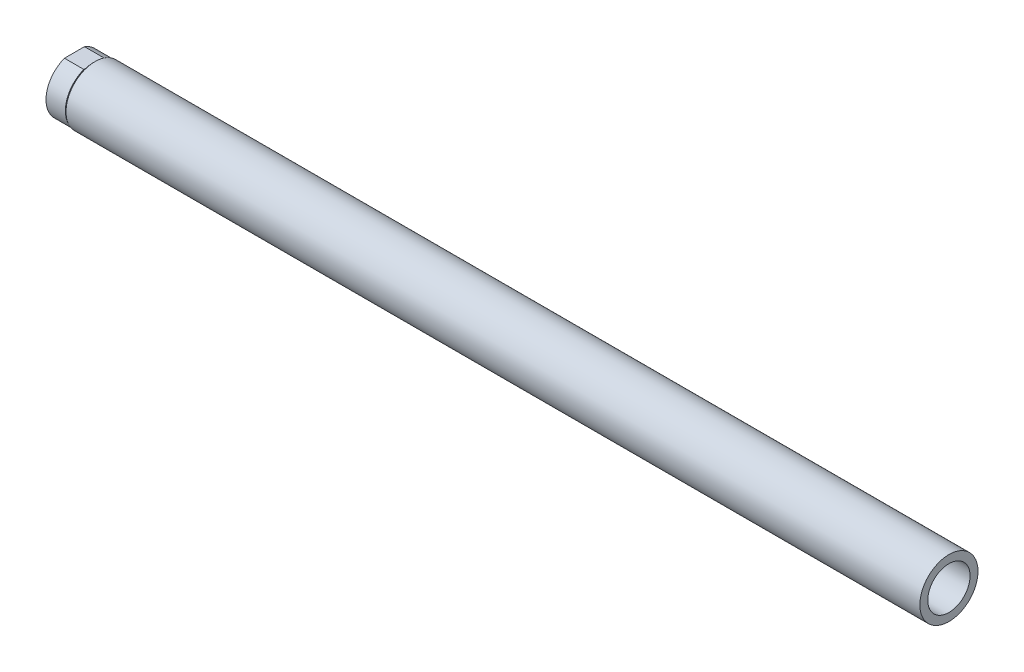
ISO-10303-21;
HEADER;
FILE_DESCRIPTION(('STEP AP214'),'2;1');
FILE_NAME('part.step','',(''),(''),'','','');
FILE_SCHEMA(('AUTOMOTIVE_DESIGN { 1 0 10303 214 1 1 1 1 }'));
ENDSEC;
DATA;
#1=APPLICATION_CONTEXT('core data for automotive mechanical design processes');
#2=APPLICATION_PROTOCOL_DEFINITION('international standard','automotive_design',2000,#1);
#3=PRODUCT_CONTEXT('',#1,'mechanical');
#4=PRODUCT('Part','Part','',(#3));
#5=PRODUCT_RELATED_PRODUCT_CATEGORY('part','',(#4));
#6=PRODUCT_DEFINITION_FORMATION('','',#4);
#7=PRODUCT_DEFINITION_CONTEXT('part definition',#1,'design');
#8=PRODUCT_DEFINITION('design','',#6,#7);
#9=PRODUCT_DEFINITION_SHAPE('','',#8);
#10=(LENGTH_UNIT() NAMED_UNIT(*) SI_UNIT(.MILLI.,.METRE.));
#11=(NAMED_UNIT(*) PLANE_ANGLE_UNIT() SI_UNIT($,.RADIAN.));
#12=(NAMED_UNIT(*) SI_UNIT($,.STERADIAN.) SOLID_ANGLE_UNIT());
#13=UNCERTAINTY_MEASURE_WITH_UNIT(LENGTH_MEASURE(1.E-05),#10,'distance_accuracy_value','');
#14=(GEOMETRIC_REPRESENTATION_CONTEXT(3) GLOBAL_UNCERTAINTY_ASSIGNED_CONTEXT((#13)) GLOBAL_UNIT_ASSIGNED_CONTEXT((#10,
#11,#12)) REPRESENTATION_CONTEXT('',''));
#15=CARTESIAN_POINT('',(0.,0.,0.));
#16=DIRECTION('',(0.,0.,1.));
#17=DIRECTION('',(1.,0.,0.));
#18=AXIS2_PLACEMENT_3D('',#15,#16,#17);
#19=CARTESIAN_POINT('',(-23.6261718694748,0.,0.));
#20=DIRECTION('',(1.,0.,0.));
#21=DIRECTION('',(0.,0.,-1.));
#22=AXIS2_PLACEMENT_3D('',#19,#20,#21);
#23=CYLINDRICAL_SURFACE('',#22,5.87499999999999);
#24=DIRECTION('',(1.,0.,0.));
#25=VECTOR('',#24,1.);
#26=CARTESIAN_POINT('',(-23.6261718694748,-5.49999999999998,2.0653389552323));
#27=LINE('',#26,#25);
#28=CARTESIAN_POINT('',(-88.25,-5.50000000000001,2.06533895523223));
#29=VERTEX_POINT('',#28);
#30=CARTESIAN_POINT('',(-92.25,-5.50000000000001,2.0653389552323));
#31=VERTEX_POINT('',#30);
#32=EDGE_CURVE('E97',#29,#31,#27,.F.);
#33=ORIENTED_EDGE('',*,*,#32,.F.);
#34=CARTESIAN_POINT('',(-88.25,0.,0.));
#35=DIRECTION('',(1.,0.,0.));
#36=DIRECTION('',(0.,0.,-1.));
#37=AXIS2_PLACEMENT_3D('',#34,#35,#36);
#38=CIRCLE('',#37,5.87499999999999);
#39=CARTESIAN_POINT('',(-88.25,5.5,2.06533895523227));
#40=VERTEX_POINT('',#39);
#41=EDGE_CURVE('E112',#40,#29,#38,.T.);
#42=ORIENTED_EDGE('',*,*,#41,.F.);
#43=DIRECTION('',(1.,0.,0.));
#44=VECTOR('',#43,1.);
#45=CARTESIAN_POINT('',(-23.6261718694748,5.5,2.06533895523227));
#46=LINE('',#45,#44);
#47=CARTESIAN_POINT('',(-92.25,5.5,2.06533895523227));
#48=VERTEX_POINT('',#47);
#49=EDGE_CURVE('E101',#48,#40,#46,.T.);
#50=ORIENTED_EDGE('',*,*,#49,.F.);
#51=CARTESIAN_POINT('',(-92.25,0.,0.));
#52=DIRECTION('',(1.,0.,0.));
#53=DIRECTION('',(0.,0.,-1.));
#54=AXIS2_PLACEMENT_3D('',#51,#52,#53);
#55=CIRCLE('',#54,5.87499999999999);
#56=EDGE_CURVE('E108',#48,#31,#55,.T.);
#57=ORIENTED_EDGE('',*,*,#56,.T.);
#58=EDGE_LOOP('',(#33,#42,#50,#57));
#59=FACE_BOUND('',#58,.T.);
#60=ADVANCED_FACE('F16',(#59),#23,.T.);
#61=CARTESIAN_POINT('',(-88.25,5.87499999999999,0.));
#62=DIRECTION('',(1.,0.,0.));
#63=DIRECTION('',(0.,0.,-1.));
#64=AXIS2_PLACEMENT_3D('',#61,#62,#63);
#65=PLANE('',#64);
#66=DIRECTION('',(0.,0.,1.));
#67=VECTOR('',#66,1.);
#68=CARTESIAN_POINT('',(-88.25,-5.50000000000001,0.));
#69=LINE('',#68,#67);
#70=CARTESIAN_POINT('',(-88.25,-5.50000000000001,-2.06533895523223));
#71=VERTEX_POINT('',#70);
#72=CARTESIAN_POINT('',(-88.25,-5.50000000000001,-1.66587381349842));
#73=VERTEX_POINT('',#72);
#74=EDGE_CURVE('E11',#71,#73,#69,.T.);
#75=ORIENTED_EDGE('',*,*,#74,.F.);
#76=CARTESIAN_POINT('',(-88.25,5.5,-2.06533895523227));
#77=VERTEX_POINT('',#76);
#78=EDGE_CURVE('E111',#71,#77,#38,.T.);
#79=ORIENTED_EDGE('',*,*,#78,.T.);
#80=DIRECTION('',(0.,0.,-1.));
#81=VECTOR('',#80,1.);
#82=CARTESIAN_POINT('',(-88.25,5.5,0.));
#83=LINE('',#82,#81);
#84=CARTESIAN_POINT('',(-88.25,5.5,-1.66587381349848));
#85=VERTEX_POINT('',#84);
#86=EDGE_CURVE('E130',#85,#77,#83,.T.);
#87=ORIENTED_EDGE('',*,*,#86,.F.);
#88=CARTESIAN_POINT('',(-88.25,0.,0.));
#89=DIRECTION('',(1.,0.,0.));
#90=DIRECTION('',(0.,0.,-1.));
#91=AXIS2_PLACEMENT_3D('',#88,#89,#90);
#92=CIRCLE('',#91,5.74674999999999);
#93=EDGE_CURVE('E128',#85,#73,#92,.F.);
#94=ORIENTED_EDGE('',*,*,#93,.T.);
#95=EDGE_LOOP('',(#75,#79,#87,#94));
#96=FACE_BOUND('',#95,.T.);
#97=ADVANCED_FACE('F154',(#96),#65,.T.);
#98=CARTESIAN_POINT('',(88.25,0.,0.));
#99=DIRECTION('',(1.,0.,0.));
#100=DIRECTION('',(0.,0.,-1.));
#101=AXIS2_PLACEMENT_3D('',#98,#99,#100);
#102=PLANE('',#101);
#103=CARTESIAN_POINT('',(88.25,0.,0.));
#104=DIRECTION('',(1.,0.,0.));
#105=DIRECTION('',(0.,0.,-1.));
#106=AXIS2_PLACEMENT_3D('',#103,#104,#105);
#107=CIRCLE('',#106,6.00075);
#108=CARTESIAN_POINT('',(88.25,0.,-6.00075));
#109=VERTEX_POINT('',#108);
#110=EDGE_CURVE('E118',#109,#109,#107,.T.);
#111=ORIENTED_EDGE('',*,*,#110,.T.);
#112=EDGE_LOOP('',(#111));
#113=FACE_BOUND('',#112,.T.);
#114=CARTESIAN_POINT('',(88.25,0.,0.));
#115=DIRECTION('',(1.,0.,0.));
#116=DIRECTION('',(0.,0.,-1.));
#117=AXIS2_PLACEMENT_3D('',#114,#115,#116);
#118=CIRCLE('',#117,4.365);
#119=CARTESIAN_POINT('',(88.25,0.,-4.365));
#120=VERTEX_POINT('',#119);
#121=EDGE_CURVE('E115',#120,#120,#118,.T.);
#122=ORIENTED_EDGE('',*,*,#121,.F.);
#123=EDGE_LOOP('',(#122));
#124=FACE_BOUND('',#123,.T.);
#125=ADVANCED_FACE('F178',(#113,#124),#102,.T.);
#126=CARTESIAN_POINT('',(88.25,0.,0.));
#127=DIRECTION('',(-1.,0.,0.));
#128=DIRECTION('',(0.,0.,1.));
#129=AXIS2_PLACEMENT_3D('',#126,#127,#128);
#130=CYLINDRICAL_SURFACE('',#129,6.00075);
#131=CARTESIAN_POINT('',(-87.996,0.,0.));
#132=DIRECTION('',(1.,0.,0.));
#133=DIRECTION('',(0.,0.,-1.));
#134=AXIS2_PLACEMENT_3D('',#131,#132,#133);
#135=CIRCLE('',#134,6.00075);
#136=CARTESIAN_POINT('',(-87.996,0.,-6.00075));
#137=VERTEX_POINT('',#136);
#138=EDGE_CURVE('E121',#137,#137,#135,.T.);
#139=ORIENTED_EDGE('',*,*,#138,.T.);
#140=EDGE_LOOP('',(#139));
#141=FACE_BOUND('',#140,.T.);
#142=ORIENTED_EDGE('',*,*,#110,.F.);
#143=EDGE_LOOP('',(#142));
#144=FACE_BOUND('',#143,.T.);
#145=ADVANCED_FACE('F252',(#141,#144),#130,.T.);
#146=CARTESIAN_POINT('',(88.25,0.,0.));
#147=DIRECTION('',(-1.,0.,0.));
#148=DIRECTION('',(0.,0.,1.));
#149=AXIS2_PLACEMENT_3D('',#146,#147,#148);
#150=CYLINDRICAL_SURFACE('',#149,4.365);
#151=CARTESIAN_POINT('',(-81.455,0.,0.));
#152=DIRECTION('',(1.,0.,0.));
#153=DIRECTION('',(0.,0.,-1.));
#154=AXIS2_PLACEMENT_3D('',#151,#152,#153);
#155=CIRCLE('',#154,4.365);
#156=CARTESIAN_POINT('',(-81.455,0.,-4.365));
#157=VERTEX_POINT('',#156);
#158=EDGE_CURVE('E127',#157,#157,#155,.T.);
#159=ORIENTED_EDGE('',*,*,#158,.F.);
#160=EDGE_LOOP('',(#159));
#161=FACE_BOUND('',#160,.T.);
#162=ORIENTED_EDGE('',*,*,#121,.T.);
#163=EDGE_LOOP('',(#162));
#164=FACE_BOUND('',#163,.T.);
#165=ADVANCED_FACE('F196',(#161,#164),#150,.F.);
#166=CARTESIAN_POINT('',(-87.996,0.,0.));
#167=DIRECTION('',(1.,0.,0.));
#168=DIRECTION('',(0.,0.,-1.));
#169=AXIS2_PLACEMENT_3D('',#166,#167,#168);
#170=CONICAL_SURFACE('',#169,6.00075,0.785398163397399);
#171=CARTESIAN_POINT('',(-88.25,5.5,1.66587381349848));
#172=VERTEX_POINT('',#171);
#173=EDGE_CURVE('E125',#172,#85,#92,.F.);
#174=ORIENTED_EDGE('',*,*,#173,.F.);
#175=CARTESIAN_POINT('',(-88.25,-5.50000000000001,1.66587381349842));
#176=VERTEX_POINT('',#175);
#177=EDGE_CURVE('E124',#176,#172,#92,.F.);
#178=ORIENTED_EDGE('',*,*,#177,.F.);
#179=EDGE_CURVE('E148',#73,#176,#92,.F.);
#180=ORIENTED_EDGE('',*,*,#179,.F.);
#181=ORIENTED_EDGE('',*,*,#93,.F.);
#182=EDGE_LOOP('',(#174,#178,#180,#181));
#183=FACE_BOUND('',#182,.T.);
#184=ORIENTED_EDGE('',*,*,#138,.F.);
#185=EDGE_LOOP('',(#184));
#186=FACE_BOUND('',#185,.T.);
#187=ADVANCED_FACE('F18',(#183,#186),#170,.T.);
#188=CARTESIAN_POINT('',(-92.25,5.87499999999999,0.));
#189=DIRECTION('',(-1.,0.,0.));
#190=DIRECTION('',(0.,0.,1.));
#191=AXIS2_PLACEMENT_3D('',#188,#189,#190);
#192=PLANE('',#191);
#193=CARTESIAN_POINT('',(-92.25,0.,0.));
#194=DIRECTION('',(-1.,0.,0.));
#195=DIRECTION('',(0.,0.,1.));
#196=AXIS2_PLACEMENT_3D('',#193,#194,#195);
#197=CIRCLE('',#196,2.5);
#198=CARTESIAN_POINT('',(-92.25,0.,2.5));
#199=VERTEX_POINT('',#198);
#200=EDGE_CURVE('E88',#199,#199,#197,.T.);
#201=ORIENTED_EDGE('',*,*,#200,.F.);
#202=EDGE_LOOP('',(#201));
#203=FACE_BOUND('',#202,.T.);
#204=DIRECTION('',(0.,0.,1.));
#205=VECTOR('',#204,1.);
#206=CARTESIAN_POINT('',(-92.25,-5.50000000000001,-6.00075));
#207=LINE('',#206,#205);
#208=CARTESIAN_POINT('',(-92.25,-5.50000000000001,-2.0653389552323));
#209=VERTEX_POINT('',#208);
#210=EDGE_CURVE('E91',#209,#31,#207,.T.);
#211=ORIENTED_EDGE('',*,*,#210,.T.);
#212=ORIENTED_EDGE('',*,*,#56,.F.);
#213=DIRECTION('',(0.,0.,1.));
#214=VECTOR('',#213,1.);
#215=CARTESIAN_POINT('',(-92.25,5.5,-6.00075));
#216=LINE('',#215,#214);
#217=CARTESIAN_POINT('',(-92.25,5.5,-2.06533895523227));
#218=VERTEX_POINT('',#217);
#219=EDGE_CURVE('E99',#218,#48,#216,.T.);
#220=ORIENTED_EDGE('',*,*,#219,.F.);
#221=EDGE_CURVE('E107',#209,#218,#55,.T.);
#222=ORIENTED_EDGE('',*,*,#221,.F.);
#223=EDGE_LOOP('',(#211,#212,#220,#222));
#224=FACE_BOUND('',#223,.T.);
#225=ADVANCED_FACE('F182',(#203,#224),#192,.T.);
#226=DIRECTION('',(1.,0.,0.));
#227=VECTOR('',#226,1.);
#228=CARTESIAN_POINT('',(-23.6261718694748,-5.49999999999998,-2.0653389552323));
#229=LINE('',#228,#227);
#230=EDGE_CURVE('E94',#209,#71,#229,.T.);
#231=ORIENTED_EDGE('',*,*,#230,.F.);
#232=ORIENTED_EDGE('',*,*,#221,.T.);
#233=DIRECTION('',(1.,0.,0.));
#234=VECTOR('',#233,1.);
#235=CARTESIAN_POINT('',(-23.6261718694748,5.5,-2.06533895523227));
#236=LINE('',#235,#234);
#237=EDGE_CURVE('E104',#77,#218,#236,.F.);
#238=ORIENTED_EDGE('',*,*,#237,.F.);
#239=ORIENTED_EDGE('',*,*,#78,.F.);
#240=EDGE_LOOP('',(#231,#232,#238,#239));
#241=FACE_BOUND('',#240,.T.);
#242=ADVANCED_FACE('F174',(#241),#23,.T.);
#243=EDGE_CURVE('E20',#176,#29,#69,.T.);
#244=ORIENTED_EDGE('',*,*,#243,.F.);
#245=ORIENTED_EDGE('',*,*,#177,.T.);
#246=EDGE_CURVE('E131',#40,#172,#83,.T.);
#247=ORIENTED_EDGE('',*,*,#246,.F.);
#248=ORIENTED_EDGE('',*,*,#41,.T.);
#249=EDGE_LOOP('',(#244,#245,#247,#248));
#250=FACE_BOUND('',#249,.T.);
#251=ADVANCED_FACE('F144',(#250),#65,.T.);
#252=CARTESIAN_POINT('',(-81.455,4.365,0.));
#253=DIRECTION('',(1.,0.,0.));
#254=DIRECTION('',(0.,0.,-1.));
#255=AXIS2_PLACEMENT_3D('',#252,#253,#254);
#256=PLANE('',#255);
#257=ORIENTED_EDGE('',*,*,#158,.T.);
#258=EDGE_LOOP('',(#257));
#259=FACE_BOUND('',#258,.T.);
#260=ADVANCED_FACE('F161',(#259),#256,.T.);
#261=CARTESIAN_POINT('',(-88.25,5.87499999999999,-6.00075));
#262=DIRECTION('',(1.,0.,0.));
#263=DIRECTION('',(0.,0.,-1.));
#264=AXIS2_PLACEMENT_3D('',#261,#262,#263);
#265=PLANE('',#264);
#266=ORIENTED_EDGE('',*,*,#173,.T.);
#267=DIRECTION('',(0.,0.,1.));
#268=VECTOR('',#267,1.);
#269=CARTESIAN_POINT('',(-88.25,5.5,-6.00075));
#270=LINE('',#269,#268);
#271=EDGE_CURVE('E38',#85,#172,#270,.T.);
#272=ORIENTED_EDGE('',*,*,#271,.T.);
#273=EDGE_LOOP('',(#266,#272));
#274=FACE_BOUND('',#273,.T.);
#275=ADVANCED_FACE('F158',(#274),#265,.F.);
#276=CARTESIAN_POINT('',(-92.25,5.5,-6.00075));
#277=DIRECTION('',(0.,-1.,0.));
#278=DIRECTION('',(0.,0.,-1.));
#279=AXIS2_PLACEMENT_3D('',#276,#277,#278);
#280=PLANE('',#279);
#281=ORIENTED_EDGE('',*,*,#237,.T.);
#282=ORIENTED_EDGE('',*,*,#219,.T.);
#283=ORIENTED_EDGE('',*,*,#49,.T.);
#284=ORIENTED_EDGE('',*,*,#246,.T.);
#285=ORIENTED_EDGE('',*,*,#271,.F.);
#286=ORIENTED_EDGE('',*,*,#86,.T.);
#287=EDGE_LOOP('',(#281,#282,#283,#284,#285,#286));
#288=FACE_BOUND('',#287,.T.);
#289=ADVANCED_FACE('F160',(#288),#280,.F.);
#290=CARTESIAN_POINT('',(-92.25,-5.50000000000001,-6.00075));
#291=DIRECTION('',(0.,1.,0.));
#292=DIRECTION('',(-1.,0.,0.));
#293=AXIS2_PLACEMENT_3D('',#290,#291,#292);
#294=PLANE('',#293);
#295=ORIENTED_EDGE('',*,*,#32,.T.);
#296=ORIENTED_EDGE('',*,*,#210,.F.);
#297=ORIENTED_EDGE('',*,*,#230,.T.);
#298=ORIENTED_EDGE('',*,*,#74,.T.);
#299=DIRECTION('',(0.,0.,1.));
#300=VECTOR('',#299,1.);
#301=CARTESIAN_POINT('',(-88.25,-5.50000000000001,-6.00075));
#302=LINE('',#301,#300);
#303=EDGE_CURVE('E30',#73,#176,#302,.T.);
#304=ORIENTED_EDGE('',*,*,#303,.T.);
#305=ORIENTED_EDGE('',*,*,#243,.T.);
#306=EDGE_LOOP('',(#295,#296,#297,#298,#304,#305));
#307=FACE_BOUND('',#306,.T.);
#308=ADVANCED_FACE('F137',(#307),#294,.F.);
#309=CARTESIAN_POINT('',(-88.25,-5.87500000000001,-6.00075));
#310=DIRECTION('',(1.,0.,0.));
#311=DIRECTION('',(0.,0.,-1.));
#312=AXIS2_PLACEMENT_3D('',#309,#310,#311);
#313=PLANE('',#312);
#314=ORIENTED_EDGE('',*,*,#179,.T.);
#315=ORIENTED_EDGE('',*,*,#303,.F.);
#316=EDGE_LOOP('',(#314,#315));
#317=FACE_BOUND('',#316,.T.);
#318=ADVANCED_FACE('F202',(#317),#313,.F.);
#319=CARTESIAN_POINT('',(-92.25,0.,0.));
#320=DIRECTION('',(-1.,0.,0.));
#321=DIRECTION('',(0.,0.,1.));
#322=AXIS2_PLACEMENT_3D('',#319,#320,#321);
#323=CYLINDRICAL_SURFACE('',#322,2.5);
#324=CARTESIAN_POINT('',(-85.2396,0.,0.));
#325=DIRECTION('',(-1.,0.,0.));
#326=DIRECTION('',(0.,0.,1.));
#327=AXIS2_PLACEMENT_3D('',#324,#325,#326);
#328=CIRCLE('',#327,2.5);
#329=CARTESIAN_POINT('',(-85.2396,0.,2.5));
#330=VERTEX_POINT('',#329);
#331=EDGE_CURVE('E83',#330,#330,#328,.T.);
#332=ORIENTED_EDGE('',*,*,#331,.F.);
#333=EDGE_LOOP('',(#332));
#334=FACE_BOUND('',#333,.T.);
#335=ORIENTED_EDGE('',*,*,#200,.T.);
#336=EDGE_LOOP('',(#335));
#337=FACE_BOUND('',#336,.T.);
#338=ADVANCED_FACE('F199',(#334,#337),#323,.F.);
#339=CARTESIAN_POINT('',(-85.2396,2.1,0.));
#340=DIRECTION('',(1.,0.,0.));
#341=DIRECTION('',(0.,0.,-1.));
#342=AXIS2_PLACEMENT_3D('',#339,#340,#341);
#343=PLANE('',#342);
#344=CARTESIAN_POINT('',(-85.2396,0.,0.));
#345=DIRECTION('',(-1.,0.,0.));
#346=DIRECTION('',(0.,0.,1.));
#347=AXIS2_PLACEMENT_3D('',#344,#345,#346);
#348=CIRCLE('',#347,2.1);
#349=CARTESIAN_POINT('',(-85.2396,0.,2.1));
#350=VERTEX_POINT('',#349);
#351=EDGE_CURVE('E80',#350,#350,#348,.T.);
#352=ORIENTED_EDGE('',*,*,#351,.F.);
#353=EDGE_LOOP('',(#352));
#354=FACE_BOUND('',#353,.T.);
#355=ORIENTED_EDGE('',*,*,#331,.T.);
#356=EDGE_LOOP('',(#355));
#357=FACE_BOUND('',#356,.T.);
#358=ADVANCED_FACE('F201',(#354,#357),#343,.F.);
#359=CARTESIAN_POINT('',(-92.25,0.,0.));
#360=DIRECTION('',(-1.,0.,0.));
#361=DIRECTION('',(0.,0.,1.));
#362=AXIS2_PLACEMENT_3D('',#359,#360,#361);
#363=CYLINDRICAL_SURFACE('',#362,2.1);
#364=CARTESIAN_POINT('',(-82.8396048,0.,0.));
#365=DIRECTION('',(-1.,0.,0.));
#366=DIRECTION('',(0.,0.,1.));
#367=AXIS2_PLACEMENT_3D('',#364,#365,#366);
#368=CIRCLE('',#367,2.1);
#369=CARTESIAN_POINT('',(-82.8396048,0.,2.1));
#370=VERTEX_POINT('',#369);
#371=EDGE_CURVE('E78',#370,#370,#368,.T.);
#372=ORIENTED_EDGE('',*,*,#371,.F.);
#373=EDGE_LOOP('',(#372));
#374=FACE_BOUND('',#373,.T.);
#375=ORIENTED_EDGE('',*,*,#351,.T.);
#376=EDGE_LOOP('',(#375));
#377=FACE_BOUND('',#376,.T.);
#378=ADVANCED_FACE('F74',(#374,#377),#363,.F.);
#379=CARTESIAN_POINT('',(-82.8396048,0.,0.));
#380=DIRECTION('',(-1.,0.,0.));
#381=DIRECTION('',(0.,0.,1.));
#382=AXIS2_PLACEMENT_3D('',#379,#380,#381);
#383=CONICAL_SURFACE('',#382,2.1,1.02974425867666);
#384=CARTESIAN_POINT('',(-81.5777975000421,0.,0.));
#385=VERTEX_POINT('',#384);
#386=VERTEX_LOOP('',#385);
#387=FACE_BOUND('',#386,.T.);
#388=ORIENTED_EDGE('',*,*,#371,.T.);
#389=EDGE_LOOP('',(#388));
#390=FACE_BOUND('',#389,.T.);
#391=ADVANCED_FACE('F71',(#387,#390),#383,.F.);
#392=CLOSED_SHELL('',(#60,#97,#125,#145,#165,#187,#225,#242,#251,#260,#275,#289,#308,#318,#338,
#358,#378,#391));
#393=MANIFOLD_SOLID_BREP('B1',#392);
#394=ADVANCED_BREP_SHAPE_REPRESENTATION('',(#18,#393),#14);
#395=SHAPE_DEFINITION_REPRESENTATION(#9,#394);
ENDSEC;
END-ISO-10303-21;
